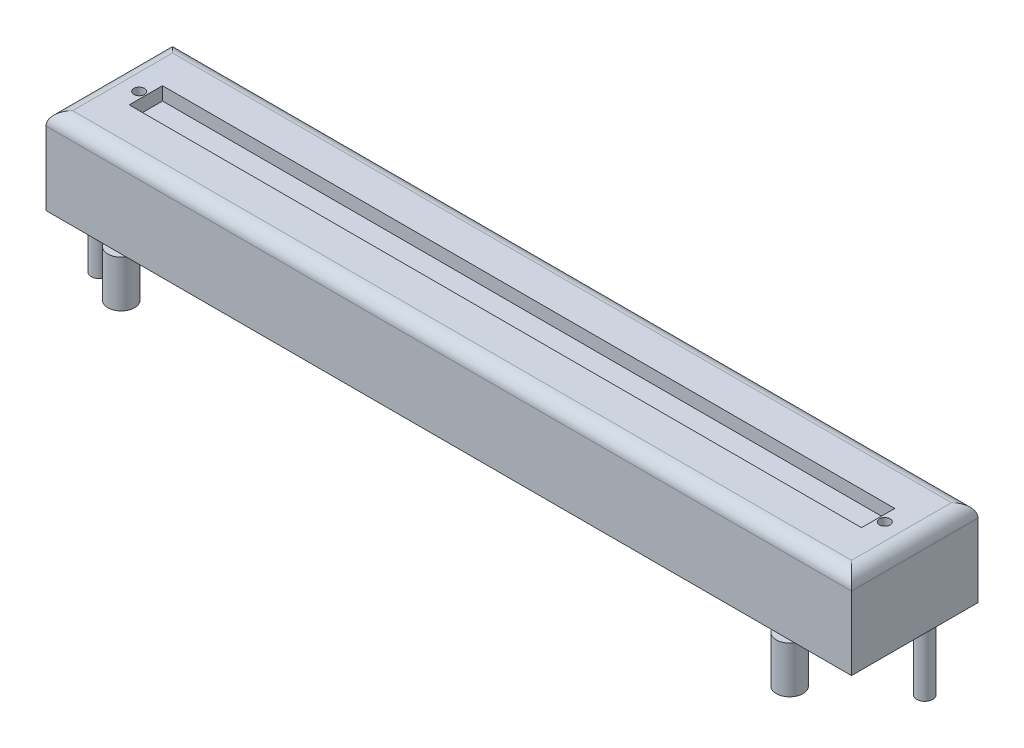
ISO-10303-21;
HEADER;
FILE_DESCRIPTION(('STEP AP214'),'2;1');
FILE_NAME('part.step','',(''),(''),'','','');
FILE_SCHEMA(('AUTOMOTIVE_DESIGN { 1 0 10303 214 1 1 1 1 }'));
ENDSEC;
DATA;
#1=APPLICATION_CONTEXT('core data for automotive mechanical design processes');
#2=APPLICATION_PROTOCOL_DEFINITION('international standard','automotive_design',2000,#1);
#3=PRODUCT_CONTEXT('',#1,'mechanical');
#4=PRODUCT('Part','Part','',(#3));
#5=PRODUCT_RELATED_PRODUCT_CATEGORY('part','',(#4));
#6=PRODUCT_DEFINITION_FORMATION('','',#4);
#7=PRODUCT_DEFINITION_CONTEXT('part definition',#1,'design');
#8=PRODUCT_DEFINITION('design','',#6,#7);
#9=PRODUCT_DEFINITION_SHAPE('','',#8);
#10=(LENGTH_UNIT() NAMED_UNIT(*) SI_UNIT(.MILLI.,.METRE.));
#11=(NAMED_UNIT(*) PLANE_ANGLE_UNIT() SI_UNIT($,.RADIAN.));
#12=(NAMED_UNIT(*) SI_UNIT($,.STERADIAN.) SOLID_ANGLE_UNIT());
#13=UNCERTAINTY_MEASURE_WITH_UNIT(LENGTH_MEASURE(1.E-05),#10,'distance_accuracy_value','');
#14=(GEOMETRIC_REPRESENTATION_CONTEXT(3) GLOBAL_UNCERTAINTY_ASSIGNED_CONTEXT((#13)) GLOBAL_UNIT_ASSIGNED_CONTEXT((#10,
#11,#12)) REPRESENTATION_CONTEXT('',''));
#15=CARTESIAN_POINT('',(0.,0.,0.));
#16=DIRECTION('',(0.,0.,1.));
#17=DIRECTION('',(1.,0.,0.));
#18=AXIS2_PLACEMENT_3D('',#15,#16,#17);
#19=CARTESIAN_POINT('',(0.,6.5,0.));
#20=DIRECTION('',(0.,1.,0.));
#21=DIRECTION('',(0.,0.,1.));
#22=AXIS2_PLACEMENT_3D('',#19,#20,#21);
#23=PLANE('',#22);
#24=DIRECTION('',(1.,0.,0.));
#25=VECTOR('',#24,1.);
#26=CARTESIAN_POINT('',(30.25,6.5,3.75));
#27=LINE('',#26,#25);
#28=CARTESIAN_POINT('',(-29.25,6.5,3.75));
#29=VERTEX_POINT('',#28);
#30=CARTESIAN_POINT('',(29.25,6.5,3.75));
#31=VERTEX_POINT('',#30);
#32=EDGE_CURVE('E260',#29,#31,#27,.T.);
#33=ORIENTED_EDGE('',*,*,#32,.T.);
#34=DIRECTION('',(0.,0.,-1.));
#35=VECTOR('',#34,1.);
#36=CARTESIAN_POINT('',(29.25,6.5,-4.75));
#37=LINE('',#36,#35);
#38=CARTESIAN_POINT('',(29.25,6.5,-3.75));
#39=VERTEX_POINT('',#38);
#40=EDGE_CURVE('E266',#31,#39,#37,.T.);
#41=ORIENTED_EDGE('',*,*,#40,.T.);
#42=DIRECTION('',(-1.,0.,0.));
#43=VECTOR('',#42,1.);
#44=CARTESIAN_POINT('',(-30.25,6.5,-3.75));
#45=LINE('',#44,#43);
#46=CARTESIAN_POINT('',(-29.25,6.5,-3.75));
#47=VERTEX_POINT('',#46);
#48=EDGE_CURVE('E264',#39,#47,#45,.T.);
#49=ORIENTED_EDGE('',*,*,#48,.T.);
#50=DIRECTION('',(0.,0.,1.));
#51=VECTOR('',#50,1.);
#52=CARTESIAN_POINT('',(-29.25,6.5,4.75));
#53=LINE('',#52,#51);
#54=EDGE_CURVE('E262',#47,#29,#53,.T.);
#55=ORIENTED_EDGE('',*,*,#54,.T.);
#56=EDGE_LOOP('',(#33,#41,#49,#55));
#57=FACE_BOUND('',#56,.T.);
#58=DIRECTION('',(0.,0.,1.));
#59=VECTOR('',#58,1.);
#60=CARTESIAN_POINT('',(-27.5,6.5,-1.25));
#61=LINE('',#60,#59);
#62=CARTESIAN_POINT('',(-27.5,6.5,-1.25));
#63=VERTEX_POINT('',#62);
#64=CARTESIAN_POINT('',(-27.5,6.5,1.25));
#65=VERTEX_POINT('',#64);
#66=EDGE_CURVE('E142',#63,#65,#61,.T.);
#67=ORIENTED_EDGE('',*,*,#66,.F.);
#68=DIRECTION('',(-1.,0.,0.));
#69=VECTOR('',#68,1.);
#70=CARTESIAN_POINT('',(-27.5,6.5,-1.25));
#71=LINE('',#70,#69);
#72=CARTESIAN_POINT('',(27.5,6.5,-1.25));
#73=VERTEX_POINT('',#72);
#74=EDGE_CURVE('E159',#73,#63,#71,.T.);
#75=ORIENTED_EDGE('',*,*,#74,.F.);
#76=DIRECTION('',(0.,0.,-1.));
#77=VECTOR('',#76,1.);
#78=CARTESIAN_POINT('',(27.5,6.5,-1.25));
#79=LINE('',#78,#77);
#80=CARTESIAN_POINT('',(27.5,6.5,1.25));
#81=VERTEX_POINT('',#80);
#82=EDGE_CURVE('E162',#81,#73,#79,.T.);
#83=ORIENTED_EDGE('',*,*,#82,.F.);
#84=DIRECTION('',(1.,0.,0.));
#85=VECTOR('',#84,1.);
#86=CARTESIAN_POINT('',(-27.5,6.5,1.25));
#87=LINE('',#86,#85);
#88=EDGE_CURVE('E168',#65,#81,#87,.T.);
#89=ORIENTED_EDGE('',*,*,#88,.F.);
#90=EDGE_LOOP('',(#67,#75,#83,#89));
#91=FACE_BOUND('',#90,.T.);
#92=CARTESIAN_POINT('',(-28.,6.5,0.));
#93=DIRECTION('',(0.,1.,0.));
#94=DIRECTION('',(0.,0.,1.));
#95=AXIS2_PLACEMENT_3D('',#92,#93,#94);
#96=CIRCLE('',#95,0.400000000000001);
#97=CARTESIAN_POINT('',(-28.,6.5,0.400000000000001));
#98=VERTEX_POINT('',#97);
#99=EDGE_CURVE('E220',#98,#98,#96,.T.);
#100=ORIENTED_EDGE('',*,*,#99,.F.);
#101=EDGE_LOOP('',(#100));
#102=FACE_BOUND('',#101,.T.);
#103=CARTESIAN_POINT('',(28.,6.5,0.));
#104=DIRECTION('',(0.,1.,0.));
#105=DIRECTION('',(0.,0.,1.));
#106=AXIS2_PLACEMENT_3D('',#103,#104,#105);
#107=CIRCLE('',#106,0.400000000000001);
#108=CARTESIAN_POINT('',(28.,6.5,0.400000000000001));
#109=VERTEX_POINT('',#108);
#110=EDGE_CURVE('E214',#109,#109,#107,.T.);
#111=ORIENTED_EDGE('',*,*,#110,.F.);
#112=EDGE_LOOP('',(#111));
#113=FACE_BOUND('',#112,.T.);
#114=ADVANCED_FACE('F34',(#57,#91,#102,#113),#23,.T.);
#115=CARTESIAN_POINT('',(0.,0.,0.));
#116=DIRECTION('',(0.,1.,0.));
#117=DIRECTION('',(0.,0.,1.));
#118=AXIS2_PLACEMENT_3D('',#115,#116,#117);
#119=PLANE('',#118);
#120=CARTESIAN_POINT('',(29.25,0.,-1.75));
#121=DIRECTION('',(0.,1.,0.));
#122=DIRECTION('',(0.,0.,1.));
#123=AXIS2_PLACEMENT_3D('',#120,#121,#122);
#124=CIRCLE('',#123,0.6);
#125=CARTESIAN_POINT('',(29.25,0.,-1.15));
#126=VERTEX_POINT('',#125);
#127=EDGE_CURVE('E257',#126,#126,#124,.F.);
#128=ORIENTED_EDGE('',*,*,#127,.F.);
#129=EDGE_LOOP('',(#128));
#130=FACE_BOUND('',#129,.T.);
#131=CARTESIAN_POINT('',(-29.25,0.,1.75));
#132=DIRECTION('',(0.,1.,0.));
#133=DIRECTION('',(0.,0.,1.));
#134=AXIS2_PLACEMENT_3D('',#131,#132,#133);
#135=CIRCLE('',#134,0.6);
#136=CARTESIAN_POINT('',(-29.25,0.,2.35));
#137=VERTEX_POINT('',#136);
#138=EDGE_CURVE('E254',#137,#137,#135,.F.);
#139=ORIENTED_EDGE('',*,*,#138,.F.);
#140=EDGE_LOOP('',(#139));
#141=FACE_BOUND('',#140,.T.);
#142=CARTESIAN_POINT('',(-29.25,0.,-1.75));
#143=DIRECTION('',(0.,1.,0.));
#144=DIRECTION('',(0.,0.,1.));
#145=AXIS2_PLACEMENT_3D('',#142,#143,#144);
#146=CIRCLE('',#145,0.6);
#147=CARTESIAN_POINT('',(-29.25,0.,-1.15));
#148=VERTEX_POINT('',#147);
#149=EDGE_CURVE('E251',#148,#148,#146,.F.);
#150=ORIENTED_EDGE('',*,*,#149,.F.);
#151=EDGE_LOOP('',(#150));
#152=FACE_BOUND('',#151,.T.);
#153=CARTESIAN_POINT('',(23.9,0.,-4.24999999999999));
#154=DIRECTION('',(0.,-1.,0.));
#155=DIRECTION('',(0.,0.,-1.));
#156=AXIS2_PLACEMENT_3D('',#153,#154,#155);
#157=CIRCLE('',#156,1.);
#158=CARTESIAN_POINT('',(24.7660254037844,0.,-4.75));
#159=VERTEX_POINT('',#158);
#160=CARTESIAN_POINT('',(23.0339745962156,0.,-4.75));
#161=VERTEX_POINT('',#160);
#162=EDGE_CURVE('E187',#159,#161,#157,.T.);
#163=ORIENTED_EDGE('',*,*,#162,.F.);
#164=DIRECTION('',(-1.,0.,0.));
#165=VECTOR('',#164,1.);
#166=CARTESIAN_POINT('',(-30.25,0.,-4.75));
#167=LINE('',#166,#165);
#168=CARTESIAN_POINT('',(30.25,0.,-4.75));
#169=VERTEX_POINT('',#168);
#170=EDGE_CURVE('E237',#169,#159,#167,.T.);
#171=ORIENTED_EDGE('',*,*,#170,.F.);
#172=DIRECTION('',(0.,0.,-1.));
#173=VECTOR('',#172,1.);
#174=CARTESIAN_POINT('',(30.25,0.,-4.75));
#175=LINE('',#174,#173);
#176=CARTESIAN_POINT('',(30.25,0.,4.75));
#177=VERTEX_POINT('',#176);
#178=EDGE_CURVE('E232',#177,#169,#175,.T.);
#179=ORIENTED_EDGE('',*,*,#178,.F.);
#180=DIRECTION('',(1.,0.,0.));
#181=VECTOR('',#180,1.);
#182=CARTESIAN_POINT('',(-30.25,0.,4.75));
#183=LINE('',#182,#181);
#184=CARTESIAN_POINT('',(25.9660254037844,0.,4.75));
#185=VERTEX_POINT('',#184);
#186=EDGE_CURVE('E228',#185,#177,#183,.T.);
#187=ORIENTED_EDGE('',*,*,#186,.F.);
#188=CARTESIAN_POINT('',(25.1,0.,4.25000000000001));
#189=DIRECTION('',(0.,-1.,0.));
#190=DIRECTION('',(0.,0.,-1.));
#191=AXIS2_PLACEMENT_3D('',#188,#189,#190);
#192=CIRCLE('',#191,1.);
#193=CARTESIAN_POINT('',(24.2339745962156,0.,4.75));
#194=VERTEX_POINT('',#193);
#195=EDGE_CURVE('E197',#194,#185,#192,.T.);
#196=ORIENTED_EDGE('',*,*,#195,.F.);
#197=CARTESIAN_POINT('',(-24.2339745962156,0.,4.75));
#198=VERTEX_POINT('',#197);
#199=EDGE_CURVE('E675',#198,#194,#183,.T.);
#200=ORIENTED_EDGE('',*,*,#199,.F.);
#201=CARTESIAN_POINT('',(-25.1,0.,4.25));
#202=DIRECTION('',(0.,-1.,0.));
#203=DIRECTION('',(0.,0.,-1.));
#204=AXIS2_PLACEMENT_3D('',#201,#202,#203);
#205=CIRCLE('',#204,1.);
#206=CARTESIAN_POINT('',(-25.9660254037844,0.,4.75));
#207=VERTEX_POINT('',#206);
#208=EDGE_CURVE('E204',#207,#198,#205,.T.);
#209=ORIENTED_EDGE('',*,*,#208,.F.);
#210=CARTESIAN_POINT('',(-30.25,0.,4.75));
#211=VERTEX_POINT('',#210);
#212=EDGE_CURVE('E229',#211,#207,#183,.T.);
#213=ORIENTED_EDGE('',*,*,#212,.F.);
#214=DIRECTION('',(0.,0.,1.));
#215=VECTOR('',#214,1.);
#216=CARTESIAN_POINT('',(-30.25,0.,-4.75));
#217=LINE('',#216,#215);
#218=CARTESIAN_POINT('',(-30.25,0.,-4.75));
#219=VERTEX_POINT('',#218);
#220=EDGE_CURVE('E223',#219,#211,#217,.T.);
#221=ORIENTED_EDGE('',*,*,#220,.F.);
#222=CARTESIAN_POINT('',(-24.7660254037844,0.,-4.75));
#223=VERTEX_POINT('',#222);
#224=EDGE_CURVE('E236',#223,#219,#167,.T.);
#225=ORIENTED_EDGE('',*,*,#224,.F.);
#226=CARTESIAN_POINT('',(-23.9,0.,-4.25));
#227=DIRECTION('',(0.,-1.,0.));
#228=DIRECTION('',(0.,0.,-1.));
#229=AXIS2_PLACEMENT_3D('',#226,#227,#228);
#230=CIRCLE('',#229,1.);
#231=CARTESIAN_POINT('',(-23.0339745962156,0.,-4.75));
#232=VERTEX_POINT('',#231);
#233=EDGE_CURVE('E211',#232,#223,#230,.T.);
#234=ORIENTED_EDGE('',*,*,#233,.F.);
#235=EDGE_CURVE('E242',#161,#232,#167,.T.);
#236=ORIENTED_EDGE('',*,*,#235,.F.);
#237=EDGE_LOOP('',(#163,#171,#179,#187,#196,#200,#209,#213,#221,#225,#234,#236));
#238=FACE_BOUND('',#237,.T.);
#239=CARTESIAN_POINT('',(-28.,0.,0.));
#240=DIRECTION('',(0.,1.,0.));
#241=DIRECTION('',(0.,0.,1.));
#242=AXIS2_PLACEMENT_3D('',#239,#240,#241);
#243=CIRCLE('',#242,0.400000000000001);
#244=CARTESIAN_POINT('',(-28.,0.,0.400000000000001));
#245=VERTEX_POINT('',#244);
#246=EDGE_CURVE('E217',#245,#245,#243,.T.);
#247=ORIENTED_EDGE('',*,*,#246,.T.);
#248=EDGE_LOOP('',(#247));
#249=FACE_BOUND('',#248,.T.);
#250=CARTESIAN_POINT('',(28.,0.,0.));
#251=DIRECTION('',(0.,1.,0.));
#252=DIRECTION('',(0.,0.,1.));
#253=AXIS2_PLACEMENT_3D('',#250,#251,#252);
#254=CIRCLE('',#253,0.400000000000001);
#255=CARTESIAN_POINT('',(28.,0.,0.400000000000001));
#256=VERTEX_POINT('',#255);
#257=EDGE_CURVE('E210',#256,#256,#254,.T.);
#258=ORIENTED_EDGE('',*,*,#257,.T.);
#259=EDGE_LOOP('',(#258));
#260=FACE_BOUND('',#259,.T.);
#261=ADVANCED_FACE('F309',(#130,#141,#152,#238,#249,#260),#119,.F.);
#262=CARTESIAN_POINT('',(-30.25,6.5,-4.75));
#263=DIRECTION('',(1.,0.,0.));
#264=DIRECTION('',(0.,0.,-1.));
#265=AXIS2_PLACEMENT_3D('',#262,#263,#264);
#266=PLANE('',#265);
#267=DIRECTION('',(0.,-1.,0.));
#268=VECTOR('',#267,1.);
#269=CARTESIAN_POINT('',(-30.25,6.5,4.75));
#270=LINE('',#269,#268);
#271=CARTESIAN_POINT('',(-30.25,5.5,4.75));
#272=VERTEX_POINT('',#271);
#273=EDGE_CURVE('E249',#272,#211,#270,.T.);
#274=ORIENTED_EDGE('',*,*,#273,.F.);
#275=DIRECTION('',(0.,0.,1.));
#276=VECTOR('',#275,1.);
#277=CARTESIAN_POINT('',(-30.25,5.5,-4.75));
#278=LINE('',#277,#276);
#279=CARTESIAN_POINT('',(-30.25,5.5,-4.75));
#280=VERTEX_POINT('',#279);
#281=EDGE_CURVE('E43',#272,#280,#278,.F.);
#282=ORIENTED_EDGE('',*,*,#281,.T.);
#283=DIRECTION('',(0.,-1.,0.));
#284=VECTOR('',#283,1.);
#285=CARTESIAN_POINT('',(-30.25,6.5,-4.75));
#286=LINE('',#285,#284);
#287=EDGE_CURVE('E240',#280,#219,#286,.T.);
#288=ORIENTED_EDGE('',*,*,#287,.T.);
#289=ORIENTED_EDGE('',*,*,#220,.T.);
#290=EDGE_LOOP('',(#274,#282,#288,#289));
#291=FACE_BOUND('',#290,.T.);
#292=ADVANCED_FACE('F326',(#291),#266,.F.);
#293=CARTESIAN_POINT('',(-30.25,6.5,4.75));
#294=DIRECTION('',(0.,0.,-1.));
#295=DIRECTION('',(-1.,0.,0.));
#296=AXIS2_PLACEMENT_3D('',#293,#294,#295);
#297=PLANE('',#296);
#298=DIRECTION('',(0.,-1.,0.));
#299=VECTOR('',#298,1.);
#300=CARTESIAN_POINT('',(30.25,6.5,4.75));
#301=LINE('',#300,#299);
#302=CARTESIAN_POINT('',(30.25,5.5,4.75));
#303=VERTEX_POINT('',#302);
#304=EDGE_CURVE('E247',#303,#177,#301,.T.);
#305=ORIENTED_EDGE('',*,*,#304,.F.);
#306=DIRECTION('',(1.,0.,0.));
#307=VECTOR('',#306,1.);
#308=CARTESIAN_POINT('',(-30.25,5.5,4.75));
#309=LINE('',#308,#307);
#310=EDGE_CURVE('E11',#303,#272,#309,.F.);
#311=ORIENTED_EDGE('',*,*,#310,.T.);
#312=ORIENTED_EDGE('',*,*,#273,.T.);
#313=ORIENTED_EDGE('',*,*,#212,.T.);
#314=EDGE_CURVE('E233',#207,#198,#183,.T.);
#315=ORIENTED_EDGE('',*,*,#314,.T.);
#316=ORIENTED_EDGE('',*,*,#199,.T.);
#317=EDGE_CURVE('E673',#194,#185,#183,.T.);
#318=ORIENTED_EDGE('',*,*,#317,.T.);
#319=ORIENTED_EDGE('',*,*,#186,.T.);
#320=EDGE_LOOP('',(#305,#311,#312,#313,#315,#316,#318,#319));
#321=FACE_BOUND('',#320,.T.);
#322=ADVANCED_FACE('F332',(#321),#297,.F.);
#323=CARTESIAN_POINT('',(30.25,6.5,-4.75));
#324=DIRECTION('',(-1.,0.,0.));
#325=DIRECTION('',(0.,0.,1.));
#326=AXIS2_PLACEMENT_3D('',#323,#324,#325);
#327=PLANE('',#326);
#328=DIRECTION('',(0.,-1.,0.));
#329=VECTOR('',#328,1.);
#330=CARTESIAN_POINT('',(30.25,6.5,-4.75));
#331=LINE('',#330,#329);
#332=CARTESIAN_POINT('',(30.25,5.5,-4.75));
#333=VERTEX_POINT('',#332);
#334=EDGE_CURVE('E245',#333,#169,#331,.T.);
#335=ORIENTED_EDGE('',*,*,#334,.F.);
#336=DIRECTION('',(0.,0.,-1.));
#337=VECTOR('',#336,1.);
#338=CARTESIAN_POINT('',(30.25,5.5,4.75));
#339=LINE('',#338,#337);
#340=EDGE_CURVE('E269',#333,#303,#339,.F.);
#341=ORIENTED_EDGE('',*,*,#340,.T.);
#342=ORIENTED_EDGE('',*,*,#304,.T.);
#343=ORIENTED_EDGE('',*,*,#178,.T.);
#344=EDGE_LOOP('',(#335,#341,#342,#343));
#345=FACE_BOUND('',#344,.T.);
#346=ADVANCED_FACE('F300',(#345),#327,.F.);
#347=CARTESIAN_POINT('',(-30.25,6.5,-4.75));
#348=DIRECTION('',(0.,0.,1.));
#349=DIRECTION('',(1.,0.,0.));
#350=AXIS2_PLACEMENT_3D('',#347,#348,#349);
#351=PLANE('',#350);
#352=ORIENTED_EDGE('',*,*,#287,.F.);
#353=DIRECTION('',(-1.,0.,0.));
#354=VECTOR('',#353,1.);
#355=CARTESIAN_POINT('',(30.25,5.5,-4.75));
#356=LINE('',#355,#354);
#357=EDGE_CURVE('E272',#280,#333,#356,.F.);
#358=ORIENTED_EDGE('',*,*,#357,.T.);
#359=ORIENTED_EDGE('',*,*,#334,.T.);
#360=ORIENTED_EDGE('',*,*,#170,.T.);
#361=EDGE_CURVE('E241',#159,#161,#167,.T.);
#362=ORIENTED_EDGE('',*,*,#361,.T.);
#363=ORIENTED_EDGE('',*,*,#235,.T.);
#364=EDGE_CURVE('E243',#232,#223,#167,.T.);
#365=ORIENTED_EDGE('',*,*,#364,.T.);
#366=ORIENTED_EDGE('',*,*,#224,.T.);
#367=EDGE_LOOP('',(#352,#358,#359,#360,#362,#363,#365,#366));
#368=FACE_BOUND('',#367,.T.);
#369=ADVANCED_FACE('F296',(#368),#351,.F.);
#370=CARTESIAN_POINT('',(-28.,6.5,0.));
#371=DIRECTION('',(0.,-1.,0.));
#372=DIRECTION('',(0.,0.,-1.));
#373=AXIS2_PLACEMENT_3D('',#370,#371,#372);
#374=CYLINDRICAL_SURFACE('',#373,0.400000000000001);
#375=ORIENTED_EDGE('',*,*,#99,.T.);
#376=EDGE_LOOP('',(#375));
#377=FACE_BOUND('',#376,.T.);
#378=ORIENTED_EDGE('',*,*,#246,.F.);
#379=EDGE_LOOP('',(#378));
#380=FACE_BOUND('',#379,.T.);
#381=ADVANCED_FACE('F321',(#377,#380),#374,.F.);
#382=CARTESIAN_POINT('',(28.,6.5,0.));
#383=DIRECTION('',(0.,-1.,0.));
#384=DIRECTION('',(0.,0.,-1.));
#385=AXIS2_PLACEMENT_3D('',#382,#383,#384);
#386=CYLINDRICAL_SURFACE('',#385,0.400000000000001);
#387=ORIENTED_EDGE('',*,*,#110,.T.);
#388=EDGE_LOOP('',(#387));
#389=FACE_BOUND('',#388,.T.);
#390=ORIENTED_EDGE('',*,*,#257,.F.);
#391=EDGE_LOOP('',(#390));
#392=FACE_BOUND('',#391,.T.);
#393=ADVANCED_FACE('F317',(#389,#392),#386,.F.);
#394=CARTESIAN_POINT('',(-23.9,-3.5,-4.25));
#395=DIRECTION('',(0.,1.,0.));
#396=DIRECTION('',(0.,0.,1.));
#397=AXIS2_PLACEMENT_3D('',#394,#395,#396);
#398=CYLINDRICAL_SURFACE('',#397,1.);
#399=CARTESIAN_POINT('',(-23.9,-3.5,-4.25));
#400=DIRECTION('',(0.,-1.,0.));
#401=DIRECTION('',(0.,0.,-1.));
#402=AXIS2_PLACEMENT_3D('',#399,#400,#401);
#403=CIRCLE('',#402,1.);
#404=CARTESIAN_POINT('',(-23.9,-3.5,-5.25));
#405=VERTEX_POINT('',#404);
#406=EDGE_CURVE('E207',#405,#405,#403,.T.);
#407=ORIENTED_EDGE('',*,*,#406,.F.);
#408=EDGE_LOOP('',(#407));
#409=FACE_BOUND('',#408,.T.);
#410=ORIENTED_EDGE('',*,*,#233,.T.);
#411=EDGE_CURVE('E203',#223,#232,#230,.T.);
#412=ORIENTED_EDGE('',*,*,#411,.T.);
#413=EDGE_LOOP('',(#410,#412));
#414=FACE_BOUND('',#413,.T.);
#415=ADVANCED_FACE('F320',(#409,#414),#398,.T.);
#416=CARTESIAN_POINT('',(-23.9,-3.5,-4.25));
#417=DIRECTION('',(0.,-1.,0.));
#418=DIRECTION('',(0.,0.,-1.));
#419=AXIS2_PLACEMENT_3D('',#416,#417,#418);
#420=PLANE('',#419);
#421=ORIENTED_EDGE('',*,*,#406,.T.);
#422=EDGE_LOOP('',(#421));
#423=FACE_BOUND('',#422,.T.);
#424=ADVANCED_FACE('F431',(#423),#420,.T.);
#425=CARTESIAN_POINT('',(-23.9,0.,-4.25));
#426=DIRECTION('',(0.,-1.,0.));
#427=DIRECTION('',(0.,0.,-1.));
#428=AXIS2_PLACEMENT_3D('',#425,#426,#427);
#429=PLANE('',#428);
#430=ORIENTED_EDGE('',*,*,#364,.F.);
#431=ORIENTED_EDGE('',*,*,#411,.F.);
#432=EDGE_LOOP('',(#430,#431));
#433=FACE_BOUND('',#432,.T.);
#434=ADVANCED_FACE('F426',(#433),#429,.F.);
#435=CARTESIAN_POINT('',(-25.1,0.,4.25));
#436=DIRECTION('',(0.,-1.,0.));
#437=DIRECTION('',(0.,0.,-1.));
#438=AXIS2_PLACEMENT_3D('',#435,#436,#437);
#439=PLANE('',#438);
#440=EDGE_CURVE('E200',#198,#207,#205,.T.);
#441=ORIENTED_EDGE('',*,*,#440,.F.);
#442=ORIENTED_EDGE('',*,*,#314,.F.);
#443=EDGE_LOOP('',(#441,#442));
#444=FACE_BOUND('',#443,.T.);
#445=ADVANCED_FACE('F422',(#444),#439,.F.);
#446=CARTESIAN_POINT('',(-25.1,-3.5,4.25));
#447=DIRECTION('',(0.,1.,0.));
#448=DIRECTION('',(0.,0.,1.));
#449=AXIS2_PLACEMENT_3D('',#446,#447,#448);
#450=CYLINDRICAL_SURFACE('',#449,1.);
#451=CARTESIAN_POINT('',(-25.1,-3.5,4.25));
#452=DIRECTION('',(0.,-1.,0.));
#453=DIRECTION('',(0.,0.,-1.));
#454=AXIS2_PLACEMENT_3D('',#451,#452,#453);
#455=CIRCLE('',#454,1.);
#456=CARTESIAN_POINT('',(-25.1,-3.5,3.25));
#457=VERTEX_POINT('',#456);
#458=EDGE_CURVE('E196',#457,#457,#455,.T.);
#459=ORIENTED_EDGE('',*,*,#458,.F.);
#460=EDGE_LOOP('',(#459));
#461=FACE_BOUND('',#460,.T.);
#462=ORIENTED_EDGE('',*,*,#440,.T.);
#463=ORIENTED_EDGE('',*,*,#208,.T.);
#464=EDGE_LOOP('',(#462,#463));
#465=FACE_BOUND('',#464,.T.);
#466=ADVANCED_FACE('F419',(#461,#465),#450,.T.);
#467=CARTESIAN_POINT('',(-25.1,-3.5,4.25));
#468=DIRECTION('',(0.,-1.,0.));
#469=DIRECTION('',(0.,0.,-1.));
#470=AXIS2_PLACEMENT_3D('',#467,#468,#469);
#471=PLANE('',#470);
#472=ORIENTED_EDGE('',*,*,#458,.T.);
#473=EDGE_LOOP('',(#472));
#474=FACE_BOUND('',#473,.T.);
#475=ADVANCED_FACE('F414',(#474),#471,.T.);
#476=CARTESIAN_POINT('',(25.1,0.,4.25000000000001));
#477=DIRECTION('',(0.,-1.,0.));
#478=DIRECTION('',(0.,0.,-1.));
#479=AXIS2_PLACEMENT_3D('',#476,#477,#478);
#480=PLANE('',#479);
#481=EDGE_CURVE('E193',#185,#194,#192,.T.);
#482=ORIENTED_EDGE('',*,*,#481,.F.);
#483=ORIENTED_EDGE('',*,*,#317,.F.);
#484=EDGE_LOOP('',(#482,#483));
#485=FACE_BOUND('',#484,.T.);
#486=ADVANCED_FACE('F410',(#485),#480,.F.);
#487=CARTESIAN_POINT('',(25.1,-3.5,4.25000000000001));
#488=DIRECTION('',(0.,1.,0.));
#489=DIRECTION('',(0.,0.,1.));
#490=AXIS2_PLACEMENT_3D('',#487,#488,#489);
#491=CYLINDRICAL_SURFACE('',#490,1.);
#492=CARTESIAN_POINT('',(25.1,-3.5,4.25000000000001));
#493=DIRECTION('',(0.,-1.,0.));
#494=DIRECTION('',(0.,0.,-1.));
#495=AXIS2_PLACEMENT_3D('',#492,#493,#494);
#496=CIRCLE('',#495,1.);
#497=CARTESIAN_POINT('',(25.1,-3.5,3.25));
#498=VERTEX_POINT('',#497);
#499=EDGE_CURVE('E189',#498,#498,#496,.T.);
#500=ORIENTED_EDGE('',*,*,#499,.F.);
#501=EDGE_LOOP('',(#500));
#502=FACE_BOUND('',#501,.T.);
#503=ORIENTED_EDGE('',*,*,#481,.T.);
#504=ORIENTED_EDGE('',*,*,#195,.T.);
#505=EDGE_LOOP('',(#503,#504));
#506=FACE_BOUND('',#505,.T.);
#507=ADVANCED_FACE('F407',(#502,#506),#491,.T.);
#508=CARTESIAN_POINT('',(25.1,-3.5,4.25000000000001));
#509=DIRECTION('',(0.,-1.,0.));
#510=DIRECTION('',(0.,0.,-1.));
#511=AXIS2_PLACEMENT_3D('',#508,#509,#510);
#512=PLANE('',#511);
#513=ORIENTED_EDGE('',*,*,#499,.T.);
#514=EDGE_LOOP('',(#513));
#515=FACE_BOUND('',#514,.T.);
#516=ADVANCED_FACE('F402',(#515),#512,.T.);
#517=CARTESIAN_POINT('',(23.9,0.,-4.24999999999999));
#518=DIRECTION('',(0.,-1.,0.));
#519=DIRECTION('',(0.,0.,-1.));
#520=AXIS2_PLACEMENT_3D('',#517,#518,#519);
#521=PLANE('',#520);
#522=EDGE_CURVE('E190',#161,#159,#157,.T.);
#523=ORIENTED_EDGE('',*,*,#522,.F.);
#524=ORIENTED_EDGE('',*,*,#361,.F.);
#525=EDGE_LOOP('',(#523,#524));
#526=FACE_BOUND('',#525,.T.);
#527=ADVANCED_FACE('F398',(#526),#521,.F.);
#528=CARTESIAN_POINT('',(23.9,-3.5,-4.24999999999999));
#529=DIRECTION('',(0.,1.,0.));
#530=DIRECTION('',(0.,0.,1.));
#531=AXIS2_PLACEMENT_3D('',#528,#529,#530);
#532=CYLINDRICAL_SURFACE('',#531,1.);
#533=CARTESIAN_POINT('',(23.9,-3.5,-4.24999999999999));
#534=DIRECTION('',(0.,-1.,0.));
#535=DIRECTION('',(0.,0.,-1.));
#536=AXIS2_PLACEMENT_3D('',#533,#534,#535);
#537=CIRCLE('',#536,1.);
#538=CARTESIAN_POINT('',(23.9,-3.5,-5.24999999999999));
#539=VERTEX_POINT('',#538);
#540=EDGE_CURVE('E186',#539,#539,#537,.T.);
#541=ORIENTED_EDGE('',*,*,#540,.F.);
#542=EDGE_LOOP('',(#541));
#543=FACE_BOUND('',#542,.T.);
#544=ORIENTED_EDGE('',*,*,#162,.T.);
#545=ORIENTED_EDGE('',*,*,#522,.T.);
#546=EDGE_LOOP('',(#544,#545));
#547=FACE_BOUND('',#546,.T.);
#548=ADVANCED_FACE('F395',(#543,#547),#532,.T.);
#549=CARTESIAN_POINT('',(23.9,-3.5,-4.24999999999999));
#550=DIRECTION('',(0.,-1.,0.));
#551=DIRECTION('',(0.,0.,-1.));
#552=AXIS2_PLACEMENT_3D('',#549,#550,#551);
#553=PLANE('',#552);
#554=ORIENTED_EDGE('',*,*,#540,.T.);
#555=EDGE_LOOP('',(#554));
#556=FACE_BOUND('',#555,.T.);
#557=ADVANCED_FACE('F393',(#556),#553,.T.);
#558=CARTESIAN_POINT('',(-29.25,-5.,-1.75));
#559=DIRECTION('',(0.,1.,0.));
#560=DIRECTION('',(0.,0.,1.));
#561=AXIS2_PLACEMENT_3D('',#558,#559,#560);
#562=CYLINDRICAL_SURFACE('',#561,0.6);
#563=CARTESIAN_POINT('',(-29.25,-5.,-1.75));
#564=DIRECTION('',(0.,-1.,0.));
#565=DIRECTION('',(0.,0.,-1.));
#566=AXIS2_PLACEMENT_3D('',#563,#564,#565);
#567=CIRCLE('',#566,0.6);
#568=CARTESIAN_POINT('',(-29.25,-5.,-2.35));
#569=VERTEX_POINT('',#568);
#570=EDGE_CURVE('E183',#569,#569,#567,.T.);
#571=ORIENTED_EDGE('',*,*,#570,.F.);
#572=EDGE_LOOP('',(#571));
#573=FACE_BOUND('',#572,.T.);
#574=ORIENTED_EDGE('',*,*,#149,.T.);
#575=EDGE_LOOP('',(#574));
#576=FACE_BOUND('',#575,.T.);
#577=ADVANCED_FACE('F389',(#573,#576),#562,.T.);
#578=CARTESIAN_POINT('',(-29.25,-5.,-1.75));
#579=DIRECTION('',(0.,-1.,0.));
#580=DIRECTION('',(0.,0.,-1.));
#581=AXIS2_PLACEMENT_3D('',#578,#579,#580);
#582=PLANE('',#581);
#583=ORIENTED_EDGE('',*,*,#570,.T.);
#584=EDGE_LOOP('',(#583));
#585=FACE_BOUND('',#584,.T.);
#586=ADVANCED_FACE('F382',(#585),#582,.T.);
#587=CARTESIAN_POINT('',(-29.25,-5.,1.75));
#588=DIRECTION('',(0.,1.,0.));
#589=DIRECTION('',(0.,0.,1.));
#590=AXIS2_PLACEMENT_3D('',#587,#588,#589);
#591=CYLINDRICAL_SURFACE('',#590,0.6);
#592=CARTESIAN_POINT('',(-29.25,-5.,1.75));
#593=DIRECTION('',(0.,-1.,0.));
#594=DIRECTION('',(0.,0.,-1.));
#595=AXIS2_PLACEMENT_3D('',#592,#593,#594);
#596=CIRCLE('',#595,0.6);
#597=CARTESIAN_POINT('',(-29.25,-5.,1.15));
#598=VERTEX_POINT('',#597);
#599=EDGE_CURVE('E180',#598,#598,#596,.T.);
#600=ORIENTED_EDGE('',*,*,#599,.F.);
#601=EDGE_LOOP('',(#600));
#602=FACE_BOUND('',#601,.T.);
#603=ORIENTED_EDGE('',*,*,#138,.T.);
#604=EDGE_LOOP('',(#603));
#605=FACE_BOUND('',#604,.T.);
#606=ADVANCED_FACE('F379',(#602,#605),#591,.T.);
#607=CARTESIAN_POINT('',(-29.25,-5.,1.75));
#608=DIRECTION('',(0.,-1.,0.));
#609=DIRECTION('',(0.,0.,-1.));
#610=AXIS2_PLACEMENT_3D('',#607,#608,#609);
#611=PLANE('',#610);
#612=ORIENTED_EDGE('',*,*,#599,.T.);
#613=EDGE_LOOP('',(#612));
#614=FACE_BOUND('',#613,.T.);
#615=ADVANCED_FACE('F374',(#614),#611,.T.);
#616=CARTESIAN_POINT('',(29.25,-5.,-1.75));
#617=DIRECTION('',(0.,1.,0.));
#618=DIRECTION('',(0.,0.,1.));
#619=AXIS2_PLACEMENT_3D('',#616,#617,#618);
#620=CYLINDRICAL_SURFACE('',#619,0.6);
#621=CARTESIAN_POINT('',(29.25,-5.,-1.75));
#622=DIRECTION('',(0.,-1.,0.));
#623=DIRECTION('',(0.,0.,-1.));
#624=AXIS2_PLACEMENT_3D('',#621,#622,#623);
#625=CIRCLE('',#624,0.6);
#626=CARTESIAN_POINT('',(29.25,-5.,-2.35));
#627=VERTEX_POINT('',#626);
#628=EDGE_CURVE('E174',#627,#627,#625,.T.);
#629=ORIENTED_EDGE('',*,*,#628,.F.);
#630=EDGE_LOOP('',(#629));
#631=FACE_BOUND('',#630,.T.);
#632=ORIENTED_EDGE('',*,*,#127,.T.);
#633=EDGE_LOOP('',(#632));
#634=FACE_BOUND('',#633,.T.);
#635=ADVANCED_FACE('F371',(#631,#634),#620,.T.);
#636=CARTESIAN_POINT('',(29.25,-5.,-1.75));
#637=DIRECTION('',(0.,-1.,0.));
#638=DIRECTION('',(0.,0.,-1.));
#639=AXIS2_PLACEMENT_3D('',#636,#637,#638);
#640=PLANE('',#639);
#641=ORIENTED_EDGE('',*,*,#628,.T.);
#642=EDGE_LOOP('',(#641));
#643=FACE_BOUND('',#642,.T.);
#644=ADVANCED_FACE('F370',(#643),#640,.T.);
#645=CARTESIAN_POINT('',(-27.5,5.5,-1.25));
#646=DIRECTION('',(-1.,0.,0.));
#647=DIRECTION('',(0.,0.,1.));
#648=AXIS2_PLACEMENT_3D('',#645,#646,#647);
#649=PLANE('',#648);
#650=ORIENTED_EDGE('',*,*,#66,.T.);
#651=DIRECTION('',(0.,1.,0.));
#652=VECTOR('',#651,1.);
#653=CARTESIAN_POINT('',(-27.5,5.5,1.25));
#654=LINE('',#653,#652);
#655=CARTESIAN_POINT('',(-27.5,5.5,1.25));
#656=VERTEX_POINT('',#655);
#657=EDGE_CURVE('E135',#656,#65,#654,.T.);
#658=ORIENTED_EDGE('',*,*,#657,.F.);
#659=DIRECTION('',(0.,0.,1.));
#660=VECTOR('',#659,1.);
#661=CARTESIAN_POINT('',(-27.5,5.5,-1.25));
#662=LINE('',#661,#660);
#663=CARTESIAN_POINT('',(-27.5,5.5,-1.25));
#664=VERTEX_POINT('',#663);
#665=EDGE_CURVE('E139',#664,#656,#662,.T.);
#666=ORIENTED_EDGE('',*,*,#665,.F.);
#667=DIRECTION('',(0.,1.,0.));
#668=VECTOR('',#667,1.);
#669=CARTESIAN_POINT('',(-27.5,5.5,-1.25));
#670=LINE('',#669,#668);
#671=EDGE_CURVE('E172',#664,#63,#670,.T.);
#672=ORIENTED_EDGE('',*,*,#671,.T.);
#673=EDGE_LOOP('',(#650,#658,#666,#672));
#674=FACE_BOUND('',#673,.T.);
#675=ADVANCED_FACE('F137',(#674),#649,.F.);
#676=CARTESIAN_POINT('',(-27.5,5.5,-1.25));
#677=DIRECTION('',(0.,0.,-1.));
#678=DIRECTION('',(-1.,0.,0.));
#679=AXIS2_PLACEMENT_3D('',#676,#677,#678);
#680=PLANE('',#679);
#681=ORIENTED_EDGE('',*,*,#74,.T.);
#682=ORIENTED_EDGE('',*,*,#671,.F.);
#683=DIRECTION('',(-1.,0.,0.));
#684=VECTOR('',#683,1.);
#685=CARTESIAN_POINT('',(-27.5,5.5,-1.25));
#686=LINE('',#685,#684);
#687=CARTESIAN_POINT('',(27.5,5.5,-1.25));
#688=VERTEX_POINT('',#687);
#689=EDGE_CURVE('E147',#688,#664,#686,.T.);
#690=ORIENTED_EDGE('',*,*,#689,.F.);
#691=DIRECTION('',(0.,1.,0.));
#692=VECTOR('',#691,1.);
#693=CARTESIAN_POINT('',(27.5,5.5,-1.25));
#694=LINE('',#693,#692);
#695=EDGE_CURVE('E175',#688,#73,#694,.T.);
#696=ORIENTED_EDGE('',*,*,#695,.T.);
#697=EDGE_LOOP('',(#681,#682,#690,#696));
#698=FACE_BOUND('',#697,.T.);
#699=ADVANCED_FACE('F361',(#698),#680,.F.);
#700=CARTESIAN_POINT('',(27.5,5.5,-1.25));
#701=DIRECTION('',(1.,0.,0.));
#702=DIRECTION('',(0.,0.,-1.));
#703=AXIS2_PLACEMENT_3D('',#700,#701,#702);
#704=PLANE('',#703);
#705=ORIENTED_EDGE('',*,*,#82,.T.);
#706=ORIENTED_EDGE('',*,*,#695,.F.);
#707=DIRECTION('',(0.,0.,-1.));
#708=VECTOR('',#707,1.);
#709=CARTESIAN_POINT('',(27.5,5.5,-1.25));
#710=LINE('',#709,#708);
#711=CARTESIAN_POINT('',(27.5,5.5,1.25));
#712=VERTEX_POINT('',#711);
#713=EDGE_CURVE('E155',#712,#688,#710,.T.);
#714=ORIENTED_EDGE('',*,*,#713,.F.);
#715=DIRECTION('',(0.,1.,0.));
#716=VECTOR('',#715,1.);
#717=CARTESIAN_POINT('',(27.5,5.5,1.25));
#718=LINE('',#717,#716);
#719=EDGE_CURVE('E146',#712,#81,#718,.T.);
#720=ORIENTED_EDGE('',*,*,#719,.T.);
#721=EDGE_LOOP('',(#705,#706,#714,#720));
#722=FACE_BOUND('',#721,.T.);
#723=ADVANCED_FACE('F358',(#722),#704,.F.);
#724=CARTESIAN_POINT('',(-27.5,5.5,1.25));
#725=DIRECTION('',(0.,0.,1.));
#726=DIRECTION('',(1.,0.,0.));
#727=AXIS2_PLACEMENT_3D('',#724,#725,#726);
#728=PLANE('',#727);
#729=ORIENTED_EDGE('',*,*,#88,.T.);
#730=ORIENTED_EDGE('',*,*,#719,.F.);
#731=DIRECTION('',(1.,0.,0.));
#732=VECTOR('',#731,1.);
#733=CARTESIAN_POINT('',(-27.5,5.5,1.25));
#734=LINE('',#733,#732);
#735=EDGE_CURVE('E150',#656,#712,#734,.T.);
#736=ORIENTED_EDGE('',*,*,#735,.F.);
#737=ORIENTED_EDGE('',*,*,#657,.T.);
#738=EDGE_LOOP('',(#729,#730,#736,#737));
#739=FACE_BOUND('',#738,.T.);
#740=ADVANCED_FACE('F151',(#739),#728,.F.);
#741=CARTESIAN_POINT('',(0.,5.5,0.));
#742=DIRECTION('',(0.,1.,0.));
#743=DIRECTION('',(0.,0.,1.));
#744=AXIS2_PLACEMENT_3D('',#741,#742,#743);
#745=PLANE('',#744);
#746=ORIENTED_EDGE('',*,*,#665,.T.);
#747=ORIENTED_EDGE('',*,*,#735,.T.);
#748=ORIENTED_EDGE('',*,*,#713,.T.);
#749=ORIENTED_EDGE('',*,*,#689,.T.);
#750=EDGE_LOOP('',(#746,#747,#748,#749));
#751=FACE_BOUND('',#750,.T.);
#752=ADVANCED_FACE('F157',(#751),#745,.T.);
#753=CARTESIAN_POINT('',(-29.25,5.5,0.));
#754=DIRECTION('',(0.,0.,-1.));
#755=DIRECTION('',(-1.,0.,0.));
#756=AXIS2_PLACEMENT_3D('',#753,#754,#755);
#757=CYLINDRICAL_SURFACE('',#756,1.);
#758=CARTESIAN_POINT('',(-29.25,5.5,-3.75));
#759=DIRECTION('',(0.707106781186547,0.,-0.707106781186547));
#760=DIRECTION('',(-0.707106781186547,0.,-0.707106781186547));
#761=AXIS2_PLACEMENT_3D('',#758,#759,#760);
#762=ELLIPSE('',#761,1.41421356237309,1.);
#763=EDGE_CURVE('E278',#280,#47,#762,.T.);
#764=ORIENTED_EDGE('',*,*,#763,.F.);
#765=ORIENTED_EDGE('',*,*,#281,.F.);
#766=CARTESIAN_POINT('',(-29.25,5.5,3.75));
#767=DIRECTION('',(-0.707106781186547,0.,-0.707106781186547));
#768=DIRECTION('',(-0.707106781186547,0.,0.707106781186547));
#769=AXIS2_PLACEMENT_3D('',#766,#767,#768);
#770=ELLIPSE('',#769,1.41421356237309,1.);
#771=EDGE_CURVE('E38',#29,#272,#770,.F.);
#772=ORIENTED_EDGE('',*,*,#771,.F.);
#773=ORIENTED_EDGE('',*,*,#54,.F.);
#774=EDGE_LOOP('',(#764,#765,#772,#773));
#775=FACE_BOUND('',#774,.T.);
#776=ADVANCED_FACE('F36',(#775),#757,.T.);
#777=CARTESIAN_POINT('',(0.,5.5,3.75));
#778=DIRECTION('',(-1.,0.,0.));
#779=DIRECTION('',(0.,0.,1.));
#780=AXIS2_PLACEMENT_3D('',#777,#778,#779);
#781=CYLINDRICAL_SURFACE('',#780,1.);
#782=ORIENTED_EDGE('',*,*,#771,.T.);
#783=ORIENTED_EDGE('',*,*,#310,.F.);
#784=CARTESIAN_POINT('',(29.25,5.5,3.75));
#785=DIRECTION('',(-0.707106781186547,0.,0.707106781186547));
#786=DIRECTION('',(-0.707106781186547,0.,-0.707106781186547));
#787=AXIS2_PLACEMENT_3D('',#784,#785,#786);
#788=ELLIPSE('',#787,1.41421356237309,1.);
#789=EDGE_CURVE('E277',#31,#303,#788,.F.);
#790=ORIENTED_EDGE('',*,*,#789,.F.);
#791=ORIENTED_EDGE('',*,*,#32,.F.);
#792=EDGE_LOOP('',(#782,#783,#790,#791));
#793=FACE_BOUND('',#792,.T.);
#794=ADVANCED_FACE('F288',(#793),#781,.T.);
#795=CARTESIAN_POINT('',(0.,5.5,-3.75));
#796=DIRECTION('',(1.,0.,0.));
#797=DIRECTION('',(0.,0.,-1.));
#798=AXIS2_PLACEMENT_3D('',#795,#796,#797);
#799=CYLINDRICAL_SURFACE('',#798,1.);
#800=ORIENTED_EDGE('',*,*,#763,.T.);
#801=ORIENTED_EDGE('',*,*,#48,.F.);
#802=CARTESIAN_POINT('',(29.25,5.5,-3.75));
#803=DIRECTION('',(0.707106781186547,0.,0.707106781186547));
#804=DIRECTION('',(0.707106781186547,0.,-0.707106781186547));
#805=AXIS2_PLACEMENT_3D('',#802,#803,#804);
#806=ELLIPSE('',#805,1.41421356237309,1.);
#807=EDGE_CURVE('E275',#333,#39,#806,.T.);
#808=ORIENTED_EDGE('',*,*,#807,.F.);
#809=ORIENTED_EDGE('',*,*,#357,.F.);
#810=EDGE_LOOP('',(#800,#801,#808,#809));
#811=FACE_BOUND('',#810,.T.);
#812=ADVANCED_FACE('F293',(#811),#799,.T.);
#813=CARTESIAN_POINT('',(29.25,5.5,0.));
#814=DIRECTION('',(0.,0.,1.));
#815=DIRECTION('',(1.,0.,0.));
#816=AXIS2_PLACEMENT_3D('',#813,#814,#815);
#817=CYLINDRICAL_SURFACE('',#816,1.);
#818=ORIENTED_EDGE('',*,*,#789,.T.);
#819=ORIENTED_EDGE('',*,*,#340,.F.);
#820=ORIENTED_EDGE('',*,*,#807,.T.);
#821=ORIENTED_EDGE('',*,*,#40,.F.);
#822=EDGE_LOOP('',(#818,#819,#820,#821));
#823=FACE_BOUND('',#822,.T.);
#824=ADVANCED_FACE('F304',(#823),#817,.T.);
#825=CLOSED_SHELL('',(#114,#261,#292,#322,#346,#369,#381,#393,#415,#424,#434,#445,#466,#475,
#486,#507,#516,#527,#548,#557,#577,#586,#606,#615,#635,#644,#675,#699,#723,#740,#752,#776,#794,
#812,#824));
#826=MANIFOLD_SOLID_BREP('B2',#825);
#827=ADVANCED_BREP_SHAPE_REPRESENTATION('',(#18,#826),#14);
#828=SHAPE_DEFINITION_REPRESENTATION(#9,#827);
ENDSEC;
END-ISO-10303-21;
